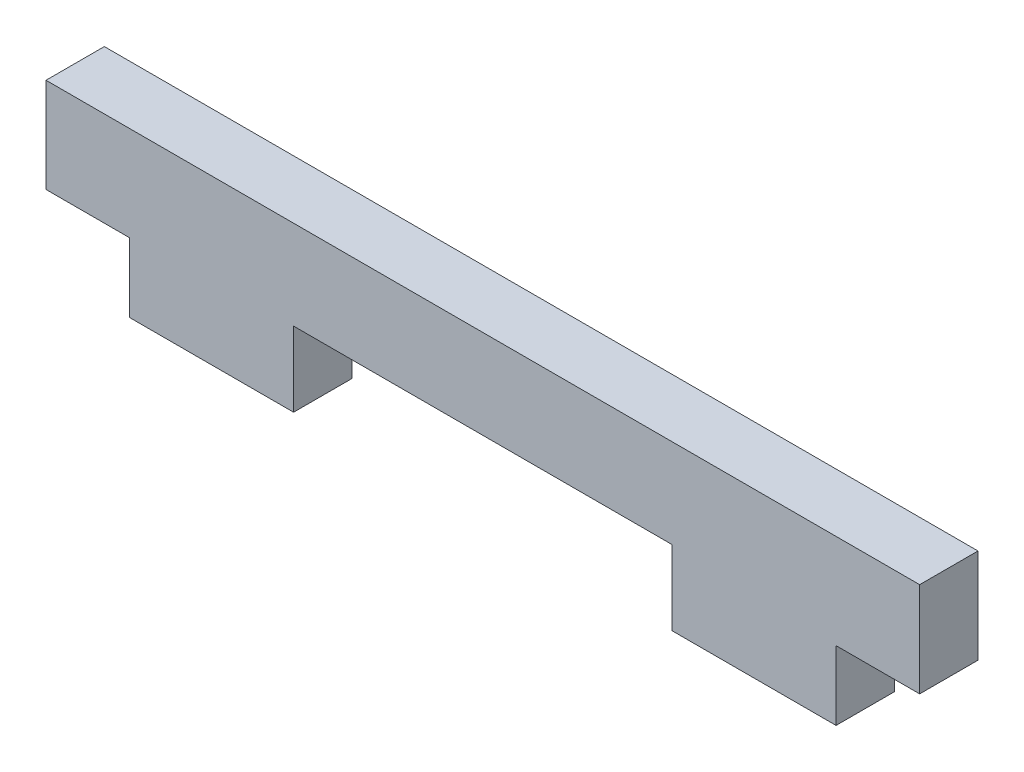
ISO-10303-21;
HEADER;
FILE_DESCRIPTION(('STEP AP214'),'2;1');
FILE_NAME('part.step','',(''),(''),'','','');
FILE_SCHEMA(('AUTOMOTIVE_DESIGN { 1 0 10303 214 1 1 1 1 }'));
ENDSEC;
DATA;
#1=APPLICATION_CONTEXT('core data for automotive mechanical design processes');
#2=APPLICATION_PROTOCOL_DEFINITION('international standard','automotive_design',2000,#1);
#3=PRODUCT_CONTEXT('',#1,'mechanical');
#4=PRODUCT('Part','Part','',(#3));
#5=PRODUCT_RELATED_PRODUCT_CATEGORY('part','',(#4));
#6=PRODUCT_DEFINITION_FORMATION('','',#4);
#7=PRODUCT_DEFINITION_CONTEXT('part definition',#1,'design');
#8=PRODUCT_DEFINITION('design','',#6,#7);
#9=PRODUCT_DEFINITION_SHAPE('','',#8);
#10=(LENGTH_UNIT() NAMED_UNIT(*) SI_UNIT(.MILLI.,.METRE.));
#11=(NAMED_UNIT(*) PLANE_ANGLE_UNIT() SI_UNIT($,.RADIAN.));
#12=(NAMED_UNIT(*) SI_UNIT($,.STERADIAN.) SOLID_ANGLE_UNIT());
#13=UNCERTAINTY_MEASURE_WITH_UNIT(LENGTH_MEASURE(1.E-05),#10,'distance_accuracy_value','');
#14=(GEOMETRIC_REPRESENTATION_CONTEXT(3) GLOBAL_UNCERTAINTY_ASSIGNED_CONTEXT((#13)) GLOBAL_UNIT_ASSIGNED_CONTEXT((#10,
#11,#12)) REPRESENTATION_CONTEXT('',''));
#15=CARTESIAN_POINT('',(0.,0.,0.));
#16=DIRECTION('',(0.,0.,1.));
#17=DIRECTION('',(1.,0.,0.));
#18=AXIS2_PLACEMENT_3D('',#15,#16,#17);
#19=CARTESIAN_POINT('',(-21.693712592762,-6.,3.7));
#20=DIRECTION('',(1.,0.,0.));
#21=DIRECTION('',(0.,1.,0.));
#22=AXIS2_PLACEMENT_3D('',#19,#20,#21);
#23=PLANE('',#22);
#24=DIRECTION('',(0.,-1.,0.));
#25=VECTOR('',#24,1.);
#26=CARTESIAN_POINT('',(-21.693712592762,-6.,0.));
#27=LINE('',#26,#25);
#28=CARTESIAN_POINT('',(-21.693712592762,0.,0.));
#29=VERTEX_POINT('',#28);
#30=CARTESIAN_POINT('',(-21.693712592762,-6.,0.));
#31=VERTEX_POINT('',#30);
#32=EDGE_CURVE('E153',#29,#31,#27,.T.);
#33=ORIENTED_EDGE('',*,*,#32,.T.);
#34=DIRECTION('',(0.,0.,-1.));
#35=VECTOR('',#34,1.);
#36=CARTESIAN_POINT('',(-21.693712592762,-6.,3.7));
#37=LINE('',#36,#35);
#38=CARTESIAN_POINT('',(-21.693712592762,-6.,3.7));
#39=VERTEX_POINT('',#38);
#40=EDGE_CURVE('E11',#39,#31,#37,.T.);
#41=ORIENTED_EDGE('',*,*,#40,.F.);
#42=DIRECTION('',(0.,-1.,0.));
#43=VECTOR('',#42,1.);
#44=CARTESIAN_POINT('',(-21.693712592762,-6.,3.7));
#45=LINE('',#44,#43);
#46=CARTESIAN_POINT('',(-21.693712592762,0.,3.7));
#47=VERTEX_POINT('',#46);
#48=EDGE_CURVE('E175',#47,#39,#45,.T.);
#49=ORIENTED_EDGE('',*,*,#48,.F.);
#50=DIRECTION('',(0.,0.,-1.));
#51=VECTOR('',#50,1.);
#52=CARTESIAN_POINT('',(-21.693712592762,0.,3.7));
#53=LINE('',#52,#51);
#54=EDGE_CURVE('E149',#47,#29,#53,.T.);
#55=ORIENTED_EDGE('',*,*,#54,.T.);
#56=EDGE_LOOP('',(#33,#41,#49,#55));
#57=FACE_BOUND('',#56,.T.);
#58=ADVANCED_FACE('F33',(#57),#23,.F.);
#59=CARTESIAN_POINT('',(-16.393712592762,-6.,3.7));
#60=DIRECTION('',(0.,1.,0.));
#61=DIRECTION('',(0.,0.,1.));
#62=AXIS2_PLACEMENT_3D('',#59,#60,#61);
#63=PLANE('',#62);
#64=DIRECTION('',(1.,0.,0.));
#65=VECTOR('',#64,1.);
#66=CARTESIAN_POINT('',(-16.393712592762,-6.,0.));
#67=LINE('',#66,#65);
#68=CARTESIAN_POINT('',(-16.393712592762,-6.,0.));
#69=VERTEX_POINT('',#68);
#70=EDGE_CURVE('E156',#31,#69,#67,.T.);
#71=ORIENTED_EDGE('',*,*,#70,.T.);
#72=DIRECTION('',(0.,0.,-1.));
#73=VECTOR('',#72,1.);
#74=CARTESIAN_POINT('',(-16.393712592762,-6.,3.7));
#75=LINE('',#74,#73);
#76=CARTESIAN_POINT('',(-16.393712592762,-6.,3.7));
#77=VERTEX_POINT('',#76);
#78=EDGE_CURVE('E41',#77,#69,#75,.T.);
#79=ORIENTED_EDGE('',*,*,#78,.F.);
#80=DIRECTION('',(1.,0.,0.));
#81=VECTOR('',#80,1.);
#82=CARTESIAN_POINT('',(-16.393712592762,-6.,3.7));
#83=LINE('',#82,#81);
#84=EDGE_CURVE('E104',#39,#77,#83,.T.);
#85=ORIENTED_EDGE('',*,*,#84,.F.);
#86=ORIENTED_EDGE('',*,*,#40,.T.);
#87=EDGE_LOOP('',(#71,#79,#85,#86));
#88=FACE_BOUND('',#87,.T.);
#89=ADVANCED_FACE('F253',(#88),#63,.F.);
#90=CARTESIAN_POINT('',(-16.393712592762,-10.3818056675996,3.7));
#91=DIRECTION('',(1.,0.,0.));
#92=DIRECTION('',(0.,0.,-1.));
#93=AXIS2_PLACEMENT_3D('',#90,#91,#92);
#94=PLANE('',#93);
#95=DIRECTION('',(0.,-1.,0.));
#96=VECTOR('',#95,1.);
#97=CARTESIAN_POINT('',(-16.393712592762,-10.3818056675996,0.));
#98=LINE('',#97,#96);
#99=CARTESIAN_POINT('',(-16.393712592762,-10.3818056675996,0.));
#100=VERTEX_POINT('',#99);
#101=EDGE_CURVE('E158',#69,#100,#98,.T.);
#102=ORIENTED_EDGE('',*,*,#101,.T.);
#103=DIRECTION('',(0.,0.,-1.));
#104=VECTOR('',#103,1.);
#105=CARTESIAN_POINT('',(-16.393712592762,-10.3818056675996,3.7));
#106=LINE('',#105,#104);
#107=CARTESIAN_POINT('',(-16.393712592762,-10.3818056675996,3.7));
#108=VERTEX_POINT('',#107);
#109=EDGE_CURVE('E194',#108,#100,#106,.T.);
#110=ORIENTED_EDGE('',*,*,#109,.F.);
#111=DIRECTION('',(0.,-1.,0.));
#112=VECTOR('',#111,1.);
#113=CARTESIAN_POINT('',(-16.393712592762,-10.3818056675996,3.7));
#114=LINE('',#113,#112);
#115=EDGE_CURVE('E202',#77,#108,#114,.T.);
#116=ORIENTED_EDGE('',*,*,#115,.F.);
#117=ORIENTED_EDGE('',*,*,#78,.T.);
#118=EDGE_LOOP('',(#102,#110,#116,#117));
#119=FACE_BOUND('',#118,.T.);
#120=ADVANCED_FACE('F200',(#119),#94,.F.);
#121=CARTESIAN_POINT('',(-5.99371259276197,-10.3818056675996,3.7));
#122=DIRECTION('',(0.,1.,0.));
#123=DIRECTION('',(0.,0.,1.));
#124=AXIS2_PLACEMENT_3D('',#121,#122,#123);
#125=PLANE('',#124);
#126=DIRECTION('',(1.,0.,0.));
#127=VECTOR('',#126,1.);
#128=CARTESIAN_POINT('',(-5.99371259276197,-10.3818056675996,0.));
#129=LINE('',#128,#127);
#130=CARTESIAN_POINT('',(-5.99371259276197,-10.3818056675996,0.));
#131=VERTEX_POINT('',#130);
#132=EDGE_CURVE('E160',#100,#131,#129,.T.);
#133=ORIENTED_EDGE('',*,*,#132,.T.);
#134=DIRECTION('',(0.,0.,-1.));
#135=VECTOR('',#134,1.);
#136=CARTESIAN_POINT('',(-5.99371259276197,-10.3818056675996,3.7));
#137=LINE('',#136,#135);
#138=CARTESIAN_POINT('',(-5.99371259276197,-10.3818056675996,3.7));
#139=VERTEX_POINT('',#138);
#140=EDGE_CURVE('E191',#139,#131,#137,.T.);
#141=ORIENTED_EDGE('',*,*,#140,.F.);
#142=DIRECTION('',(1.,0.,0.));
#143=VECTOR('',#142,1.);
#144=CARTESIAN_POINT('',(-5.99371259276197,-10.3818056675996,3.7));
#145=LINE('',#144,#143);
#146=EDGE_CURVE('E220',#108,#139,#145,.T.);
#147=ORIENTED_EDGE('',*,*,#146,.F.);
#148=ORIENTED_EDGE('',*,*,#109,.T.);
#149=EDGE_LOOP('',(#133,#141,#147,#148));
#150=FACE_BOUND('',#149,.T.);
#151=ADVANCED_FACE('F211',(#150),#125,.F.);
#152=CARTESIAN_POINT('',(-5.99371259276197,-5.65013306973486,3.7));
#153=DIRECTION('',(-1.,0.,0.));
#154=DIRECTION('',(0.,0.,1.));
#155=AXIS2_PLACEMENT_3D('',#152,#153,#154);
#156=PLANE('',#155);
#157=DIRECTION('',(0.,1.,0.));
#158=VECTOR('',#157,1.);
#159=CARTESIAN_POINT('',(-5.99371259276197,-5.65013306973486,0.));
#160=LINE('',#159,#158);
#161=CARTESIAN_POINT('',(-5.99371259276197,-5.65013306973486,0.));
#162=VERTEX_POINT('',#161);
#163=EDGE_CURVE('E162',#131,#162,#160,.T.);
#164=ORIENTED_EDGE('',*,*,#163,.T.);
#165=DIRECTION('',(0.,0.,-1.));
#166=VECTOR('',#165,1.);
#167=CARTESIAN_POINT('',(-5.99371259276197,-5.65013306973486,3.7));
#168=LINE('',#167,#166);
#169=CARTESIAN_POINT('',(-5.99371259276197,-5.65013306973486,3.7));
#170=VERTEX_POINT('',#169);
#171=EDGE_CURVE('E188',#170,#162,#168,.T.);
#172=ORIENTED_EDGE('',*,*,#171,.F.);
#173=DIRECTION('',(0.,1.,0.));
#174=VECTOR('',#173,1.);
#175=CARTESIAN_POINT('',(-5.99371259276197,-5.65013306973486,3.7));
#176=LINE('',#175,#174);
#177=EDGE_CURVE('E217',#139,#170,#176,.T.);
#178=ORIENTED_EDGE('',*,*,#177,.F.);
#179=ORIENTED_EDGE('',*,*,#140,.T.);
#180=EDGE_LOOP('',(#164,#172,#178,#179));
#181=FACE_BOUND('',#180,.T.);
#182=ADVANCED_FACE('F215',(#181),#156,.F.);
#183=CARTESIAN_POINT('',(18.006287407238,-5.65013306973486,3.7));
#184=DIRECTION('',(0.,1.,0.));
#185=DIRECTION('',(0.,0.,1.));
#186=AXIS2_PLACEMENT_3D('',#183,#184,#185);
#187=PLANE('',#186);
#188=DIRECTION('',(1.,0.,0.));
#189=VECTOR('',#188,1.);
#190=CARTESIAN_POINT('',(18.006287407238,-5.65013306973486,0.));
#191=LINE('',#190,#189);
#192=CARTESIAN_POINT('',(18.006287407238,-5.65013306973486,0.));
#193=VERTEX_POINT('',#192);
#194=EDGE_CURVE('E164',#162,#193,#191,.T.);
#195=ORIENTED_EDGE('',*,*,#194,.T.);
#196=DIRECTION('',(0.,0.,-1.));
#197=VECTOR('',#196,1.);
#198=CARTESIAN_POINT('',(18.006287407238,-5.65013306973486,3.7));
#199=LINE('',#198,#197);
#200=CARTESIAN_POINT('',(18.006287407238,-5.65013306973486,3.7));
#201=VERTEX_POINT('',#200);
#202=EDGE_CURVE('E185',#201,#193,#199,.T.);
#203=ORIENTED_EDGE('',*,*,#202,.F.);
#204=DIRECTION('',(1.,0.,0.));
#205=VECTOR('',#204,1.);
#206=CARTESIAN_POINT('',(18.006287407238,-5.65013306973486,3.7));
#207=LINE('',#206,#205);
#208=EDGE_CURVE('E219',#170,#201,#207,.T.);
#209=ORIENTED_EDGE('',*,*,#208,.F.);
#210=ORIENTED_EDGE('',*,*,#171,.T.);
#211=EDGE_LOOP('',(#195,#203,#209,#210));
#212=FACE_BOUND('',#211,.T.);
#213=ADVANCED_FACE('F266',(#212),#187,.F.);
#214=CARTESIAN_POINT('',(18.006287407238,-10.3818056675996,3.7));
#215=DIRECTION('',(1.,0.,0.));
#216=DIRECTION('',(0.,0.,-1.));
#217=AXIS2_PLACEMENT_3D('',#214,#215,#216);
#218=PLANE('',#217);
#219=DIRECTION('',(0.,-1.,0.));
#220=VECTOR('',#219,1.);
#221=CARTESIAN_POINT('',(18.006287407238,-10.3818056675996,0.));
#222=LINE('',#221,#220);
#223=CARTESIAN_POINT('',(18.006287407238,-10.3818056675996,0.));
#224=VERTEX_POINT('',#223);
#225=EDGE_CURVE('E166',#193,#224,#222,.T.);
#226=ORIENTED_EDGE('',*,*,#225,.T.);
#227=DIRECTION('',(0.,0.,-1.));
#228=VECTOR('',#227,1.);
#229=CARTESIAN_POINT('',(18.006287407238,-10.3818056675996,3.7));
#230=LINE('',#229,#228);
#231=CARTESIAN_POINT('',(18.006287407238,-10.3818056675996,3.7));
#232=VERTEX_POINT('',#231);
#233=EDGE_CURVE('E182',#232,#224,#230,.T.);
#234=ORIENTED_EDGE('',*,*,#233,.F.);
#235=DIRECTION('',(0.,-1.,0.));
#236=VECTOR('',#235,1.);
#237=CARTESIAN_POINT('',(18.006287407238,-10.3818056675996,3.7));
#238=LINE('',#237,#236);
#239=EDGE_CURVE('E222',#201,#232,#238,.T.);
#240=ORIENTED_EDGE('',*,*,#239,.F.);
#241=ORIENTED_EDGE('',*,*,#202,.T.);
#242=EDGE_LOOP('',(#226,#234,#240,#241));
#243=FACE_BOUND('',#242,.T.);
#244=ADVANCED_FACE('F269',(#243),#218,.F.);
#245=CARTESIAN_POINT('',(28.406287407238,-10.3818056675996,3.7));
#246=DIRECTION('',(0.,1.,0.));
#247=DIRECTION('',(0.,0.,1.));
#248=AXIS2_PLACEMENT_3D('',#245,#246,#247);
#249=PLANE('',#248);
#250=DIRECTION('',(1.,0.,0.));
#251=VECTOR('',#250,1.);
#252=CARTESIAN_POINT('',(28.406287407238,-10.3818056675996,0.));
#253=LINE('',#252,#251);
#254=CARTESIAN_POINT('',(28.406287407238,-10.3818056675996,0.));
#255=VERTEX_POINT('',#254);
#256=EDGE_CURVE('E168',#224,#255,#253,.T.);
#257=ORIENTED_EDGE('',*,*,#256,.T.);
#258=DIRECTION('',(0.,0.,-1.));
#259=VECTOR('',#258,1.);
#260=CARTESIAN_POINT('',(28.406287407238,-10.3818056675996,3.7));
#261=LINE('',#260,#259);
#262=CARTESIAN_POINT('',(28.406287407238,-10.3818056675996,3.7));
#263=VERTEX_POINT('',#262);
#264=EDGE_CURVE('E179',#263,#255,#261,.T.);
#265=ORIENTED_EDGE('',*,*,#264,.F.);
#266=DIRECTION('',(1.,0.,0.));
#267=VECTOR('',#266,1.);
#268=CARTESIAN_POINT('',(28.406287407238,-10.3818056675996,3.7));
#269=LINE('',#268,#267);
#270=EDGE_CURVE('E228',#232,#263,#269,.T.);
#271=ORIENTED_EDGE('',*,*,#270,.F.);
#272=ORIENTED_EDGE('',*,*,#233,.T.);
#273=EDGE_LOOP('',(#257,#265,#271,#272));
#274=FACE_BOUND('',#273,.T.);
#275=ADVANCED_FACE('F234',(#274),#249,.F.);
#276=CARTESIAN_POINT('',(28.406287407238,-6.,3.7));
#277=DIRECTION('',(-1.,0.,0.));
#278=DIRECTION('',(0.,0.,1.));
#279=AXIS2_PLACEMENT_3D('',#276,#277,#278);
#280=PLANE('',#279);
#281=DIRECTION('',(0.,1.,0.));
#282=VECTOR('',#281,1.);
#283=CARTESIAN_POINT('',(28.406287407238,-6.,0.));
#284=LINE('',#283,#282);
#285=CARTESIAN_POINT('',(28.406287407238,-6.,0.));
#286=VERTEX_POINT('',#285);
#287=EDGE_CURVE('E170',#255,#286,#284,.T.);
#288=ORIENTED_EDGE('',*,*,#287,.T.);
#289=DIRECTION('',(0.,0.,-1.));
#290=VECTOR('',#289,1.);
#291=CARTESIAN_POINT('',(28.406287407238,-6.,3.7));
#292=LINE('',#291,#290);
#293=CARTESIAN_POINT('',(28.406287407238,-6.,3.7));
#294=VERTEX_POINT('',#293);
#295=EDGE_CURVE('E144',#294,#286,#292,.T.);
#296=ORIENTED_EDGE('',*,*,#295,.F.);
#297=DIRECTION('',(0.,1.,0.));
#298=VECTOR('',#297,1.);
#299=CARTESIAN_POINT('',(28.406287407238,-6.,3.7));
#300=LINE('',#299,#298);
#301=EDGE_CURVE('E135',#263,#294,#300,.T.);
#302=ORIENTED_EDGE('',*,*,#301,.F.);
#303=ORIENTED_EDGE('',*,*,#264,.T.);
#304=EDGE_LOOP('',(#288,#296,#302,#303));
#305=FACE_BOUND('',#304,.T.);
#306=ADVANCED_FACE('F238',(#305),#280,.F.);
#307=CARTESIAN_POINT('',(33.706287407238,-6.,3.7));
#308=DIRECTION('',(0.,1.,0.));
#309=DIRECTION('',(0.,0.,1.));
#310=AXIS2_PLACEMENT_3D('',#307,#308,#309);
#311=PLANE('',#310);
#312=DIRECTION('',(1.,0.,0.));
#313=VECTOR('',#312,1.);
#314=CARTESIAN_POINT('',(33.706287407238,-6.,0.));
#315=LINE('',#314,#313);
#316=CARTESIAN_POINT('',(33.706287407238,-6.,0.));
#317=VERTEX_POINT('',#316);
#318=EDGE_CURVE('E143',#286,#317,#315,.T.);
#319=ORIENTED_EDGE('',*,*,#318,.T.);
#320=DIRECTION('',(0.,0.,-1.));
#321=VECTOR('',#320,1.);
#322=CARTESIAN_POINT('',(33.706287407238,-6.,3.7));
#323=LINE('',#322,#321);
#324=CARTESIAN_POINT('',(33.706287407238,-6.,3.7));
#325=VERTEX_POINT('',#324);
#326=EDGE_CURVE('E140',#325,#317,#323,.T.);
#327=ORIENTED_EDGE('',*,*,#326,.F.);
#328=DIRECTION('',(1.,0.,0.));
#329=VECTOR('',#328,1.);
#330=CARTESIAN_POINT('',(33.706287407238,-6.,3.7));
#331=LINE('',#330,#329);
#332=EDGE_CURVE('E129',#294,#325,#331,.T.);
#333=ORIENTED_EDGE('',*,*,#332,.F.);
#334=ORIENTED_EDGE('',*,*,#295,.T.);
#335=EDGE_LOOP('',(#319,#327,#333,#334));
#336=FACE_BOUND('',#335,.T.);
#337=ADVANCED_FACE('F141',(#336),#311,.F.);
#338=CARTESIAN_POINT('',(33.706287407238,0.,3.7));
#339=DIRECTION('',(-1.,0.,0.));
#340=DIRECTION('',(0.,0.,1.));
#341=AXIS2_PLACEMENT_3D('',#338,#339,#340);
#342=PLANE('',#341);
#343=DIRECTION('',(0.,1.,0.));
#344=VECTOR('',#343,1.);
#345=CARTESIAN_POINT('',(33.706287407238,0.,0.));
#346=LINE('',#345,#344);
#347=CARTESIAN_POINT('',(33.706287407238,0.,0.));
#348=VERTEX_POINT('',#347);
#349=EDGE_CURVE('E90',#317,#348,#346,.T.);
#350=ORIENTED_EDGE('',*,*,#349,.T.);
#351=DIRECTION('',(0.,0.,-1.));
#352=VECTOR('',#351,1.);
#353=CARTESIAN_POINT('',(33.706287407238,0.,3.7));
#354=LINE('',#353,#352);
#355=CARTESIAN_POINT('',(33.706287407238,0.,3.7));
#356=VERTEX_POINT('',#355);
#357=EDGE_CURVE('E145',#356,#348,#354,.T.);
#358=ORIENTED_EDGE('',*,*,#357,.F.);
#359=DIRECTION('',(0.,1.,0.));
#360=VECTOR('',#359,1.);
#361=CARTESIAN_POINT('',(33.706287407238,0.,3.7));
#362=LINE('',#361,#360);
#363=EDGE_CURVE('E133',#325,#356,#362,.T.);
#364=ORIENTED_EDGE('',*,*,#363,.F.);
#365=ORIENTED_EDGE('',*,*,#326,.T.);
#366=EDGE_LOOP('',(#350,#358,#364,#365));
#367=FACE_BOUND('',#366,.T.);
#368=ADVANCED_FACE('F147',(#367),#342,.F.);
#369=CARTESIAN_POINT('',(-21.693712592762,0.,3.7));
#370=DIRECTION('',(0.,-1.,0.));
#371=DIRECTION('',(0.,0.,-1.));
#372=AXIS2_PLACEMENT_3D('',#369,#370,#371);
#373=PLANE('',#372);
#374=DIRECTION('',(-1.,0.,0.));
#375=VECTOR('',#374,1.);
#376=CARTESIAN_POINT('',(-21.693712592762,0.,0.));
#377=LINE('',#376,#375);
#378=EDGE_CURVE('E96',#348,#29,#377,.T.);
#379=ORIENTED_EDGE('',*,*,#378,.T.);
#380=ORIENTED_EDGE('',*,*,#54,.F.);
#381=DIRECTION('',(-1.,0.,0.));
#382=VECTOR('',#381,1.);
#383=CARTESIAN_POINT('',(-21.693712592762,0.,3.7));
#384=LINE('',#383,#382);
#385=EDGE_CURVE('E49',#356,#47,#384,.T.);
#386=ORIENTED_EDGE('',*,*,#385,.F.);
#387=ORIENTED_EDGE('',*,*,#357,.T.);
#388=EDGE_LOOP('',(#379,#380,#386,#387));
#389=FACE_BOUND('',#388,.T.);
#390=ADVANCED_FACE('F242',(#389),#373,.F.);
#391=CARTESIAN_POINT('',(0.,0.,3.7));
#392=DIRECTION('',(0.,0.,-1.));
#393=DIRECTION('',(-1.,0.,0.));
#394=AXIS2_PLACEMENT_3D('',#391,#392,#393);
#395=PLANE('',#394);
#396=ORIENTED_EDGE('',*,*,#48,.T.);
#397=ORIENTED_EDGE('',*,*,#84,.T.);
#398=ORIENTED_EDGE('',*,*,#115,.T.);
#399=ORIENTED_EDGE('',*,*,#146,.T.);
#400=ORIENTED_EDGE('',*,*,#177,.T.);
#401=ORIENTED_EDGE('',*,*,#208,.T.);
#402=ORIENTED_EDGE('',*,*,#239,.T.);
#403=ORIENTED_EDGE('',*,*,#270,.T.);
#404=ORIENTED_EDGE('',*,*,#301,.T.);
#405=ORIENTED_EDGE('',*,*,#332,.T.);
#406=ORIENTED_EDGE('',*,*,#363,.T.);
#407=ORIENTED_EDGE('',*,*,#385,.T.);
#408=EDGE_LOOP('',(#396,#397,#398,#399,#400,#401,#402,#403,#404,#405,#406,#407));
#409=FACE_BOUND('',#408,.T.);
#410=ADVANCED_FACE('F131',(#409),#395,.F.);
#411=CARTESIAN_POINT('',(0.,0.,0.));
#412=DIRECTION('',(0.,0.,-1.));
#413=DIRECTION('',(-1.,0.,0.));
#414=AXIS2_PLACEMENT_3D('',#411,#412,#413);
#415=PLANE('',#414);
#416=ORIENTED_EDGE('',*,*,#32,.F.);
#417=ORIENTED_EDGE('',*,*,#378,.F.);
#418=ORIENTED_EDGE('',*,*,#349,.F.);
#419=ORIENTED_EDGE('',*,*,#318,.F.);
#420=ORIENTED_EDGE('',*,*,#287,.F.);
#421=ORIENTED_EDGE('',*,*,#256,.F.);
#422=ORIENTED_EDGE('',*,*,#225,.F.);
#423=ORIENTED_EDGE('',*,*,#194,.F.);
#424=ORIENTED_EDGE('',*,*,#163,.F.);
#425=ORIENTED_EDGE('',*,*,#132,.F.);
#426=ORIENTED_EDGE('',*,*,#101,.F.);
#427=ORIENTED_EDGE('',*,*,#70,.F.);
#428=EDGE_LOOP('',(#416,#417,#418,#419,#420,#421,#422,#423,#424,#425,#426,#427));
#429=FACE_BOUND('',#428,.T.);
#430=ADVANCED_FACE('F206',(#429),#415,.T.);
#431=CLOSED_SHELL('',(#58,#89,#120,#151,#182,#213,#244,#275,#306,#337,#368,#390,#410,#430));
#432=MANIFOLD_SOLID_BREP('B2',#431);
#433=ADVANCED_BREP_SHAPE_REPRESENTATION('',(#18,#432),#14);
#434=SHAPE_DEFINITION_REPRESENTATION(#9,#433);
ENDSEC;
END-ISO-10303-21;
